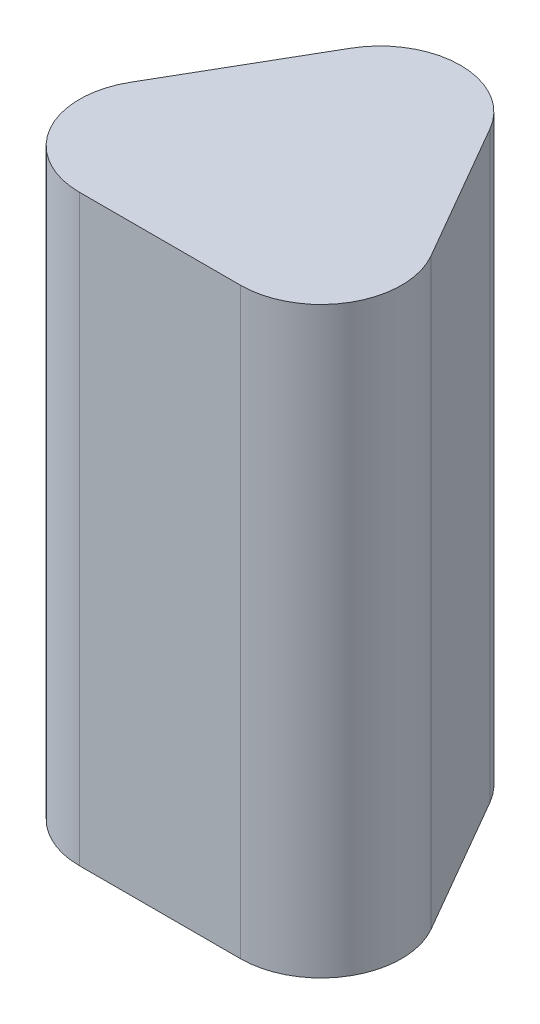
ISO-10303-21;
HEADER;
FILE_DESCRIPTION(('STEP AP214'),'2;1');
FILE_NAME('part.step','',(''),(''),'','','');
FILE_SCHEMA(('AUTOMOTIVE_DESIGN { 1 0 10303 214 1 1 1 1 }'));
ENDSEC;
DATA;
#1=APPLICATION_CONTEXT('core data for automotive mechanical design processes');
#2=APPLICATION_PROTOCOL_DEFINITION('international standard','automotive_design',2000,#1);
#3=PRODUCT_CONTEXT('',#1,'mechanical');
#4=PRODUCT('Part','Part','',(#3));
#5=PRODUCT_RELATED_PRODUCT_CATEGORY('part','',(#4));
#6=PRODUCT_DEFINITION_FORMATION('','',#4);
#7=PRODUCT_DEFINITION_CONTEXT('part definition',#1,'design');
#8=PRODUCT_DEFINITION('design','',#6,#7);
#9=PRODUCT_DEFINITION_SHAPE('','',#8);
#10=(LENGTH_UNIT() NAMED_UNIT(*) SI_UNIT(.MILLI.,.METRE.));
#11=(NAMED_UNIT(*) PLANE_ANGLE_UNIT() SI_UNIT($,.RADIAN.));
#12=(NAMED_UNIT(*) SI_UNIT($,.STERADIAN.) SOLID_ANGLE_UNIT());
#13=UNCERTAINTY_MEASURE_WITH_UNIT(LENGTH_MEASURE(1.E-05),#10,'distance_accuracy_value','');
#14=(GEOMETRIC_REPRESENTATION_CONTEXT(3) GLOBAL_UNCERTAINTY_ASSIGNED_CONTEXT((#13)) GLOBAL_UNIT_ASSIGNED_CONTEXT((#10,
#11,#12)) REPRESENTATION_CONTEXT('',''));
#15=CARTESIAN_POINT('',(0.,0.,0.));
#16=DIRECTION('',(0.,0.,1.));
#17=DIRECTION('',(1.,0.,0.));
#18=AXIS2_PLACEMENT_3D('',#15,#16,#17);
#19=CARTESIAN_POINT('',(-9.25,67.,25.2714699700121));
#20=DIRECTION('',(0.,-1.,0.));
#21=DIRECTION('',(0.,0.,-1.));
#22=AXIS2_PLACEMENT_3D('',#19,#20,#21);
#23=CYLINDRICAL_SURFACE('',#22,9.25);
#24=CARTESIAN_POINT('',(-9.25,0.,25.2714699700121));
#25=DIRECTION('',(0.,1.,0.));
#26=DIRECTION('',(0.,0.,1.));
#27=AXIS2_PLACEMENT_3D('',#24,#25,#26);
#28=CIRCLE('',#27,9.25);
#29=CARTESIAN_POINT('',(-17.2607349850061,0.,20.6464699700121));
#30=VERTEX_POINT('',#29);
#31=CARTESIAN_POINT('',(-9.25,0.,34.5214699700121));
#32=VERTEX_POINT('',#31);
#33=EDGE_CURVE('E123',#30,#32,#28,.T.);
#34=ORIENTED_EDGE('',*,*,#33,.T.);
#35=DIRECTION('',(0.,-1.,0.));
#36=VECTOR('',#35,1.);
#37=CARTESIAN_POINT('',(-9.25,67.,34.5214699700121));
#38=LINE('',#37,#36);
#39=CARTESIAN_POINT('',(-9.25,67.,34.5214699700121));
#40=VERTEX_POINT('',#39);
#41=EDGE_CURVE('E11',#40,#32,#38,.T.);
#42=ORIENTED_EDGE('',*,*,#41,.F.);
#43=CARTESIAN_POINT('',(-9.25,67.,25.2714699700121));
#44=DIRECTION('',(0.,1.,0.));
#45=DIRECTION('',(0.,0.,1.));
#46=AXIS2_PLACEMENT_3D('',#43,#44,#45);
#47=CIRCLE('',#46,9.25);
#48=CARTESIAN_POINT('',(-17.2607349850061,67.,20.6464699700121));
#49=VERTEX_POINT('',#48);
#50=EDGE_CURVE('E133',#49,#40,#47,.T.);
#51=ORIENTED_EDGE('',*,*,#50,.F.);
#52=DIRECTION('',(0.,-1.,0.));
#53=VECTOR('',#52,1.);
#54=CARTESIAN_POINT('',(-17.2607349850061,67.,20.6464699700121));
#55=LINE('',#54,#53);
#56=EDGE_CURVE('E119',#49,#30,#55,.T.);
#57=ORIENTED_EDGE('',*,*,#56,.T.);
#58=EDGE_LOOP('',(#34,#42,#51,#57));
#59=FACE_BOUND('',#58,.T.);
#60=ADVANCED_FACE('F39',(#59),#23,.T.);
#61=CARTESIAN_POINT('',(-9.25,67.,34.5214699700121));
#62=DIRECTION('',(0.,0.,-1.));
#63=DIRECTION('',(-1.,0.,0.));
#64=AXIS2_PLACEMENT_3D('',#61,#62,#63);
#65=PLANE('',#64);
#66=DIRECTION('',(1.,0.,0.));
#67=VECTOR('',#66,1.);
#68=CARTESIAN_POINT('',(-9.25,0.,34.5214699700121));
#69=LINE('',#68,#67);
#70=CARTESIAN_POINT('',(9.25,0.,34.5214699700121));
#71=VERTEX_POINT('',#70);
#72=EDGE_CURVE('E126',#32,#71,#69,.T.);
#73=ORIENTED_EDGE('',*,*,#72,.T.);
#74=DIRECTION('',(0.,-1.,0.));
#75=VECTOR('',#74,1.);
#76=CARTESIAN_POINT('',(9.25,67.,34.5214699700121));
#77=LINE('',#76,#75);
#78=CARTESIAN_POINT('',(9.25,67.,34.5214699700121));
#79=VERTEX_POINT('',#78);
#80=EDGE_CURVE('E47',#79,#71,#77,.T.);
#81=ORIENTED_EDGE('',*,*,#80,.F.);
#82=DIRECTION('',(1.,0.,0.));
#83=VECTOR('',#82,1.);
#84=CARTESIAN_POINT('',(-9.25,67.,34.5214699700121));
#85=LINE('',#84,#83);
#86=EDGE_CURVE('E92',#40,#79,#85,.T.);
#87=ORIENTED_EDGE('',*,*,#86,.F.);
#88=ORIENTED_EDGE('',*,*,#41,.T.);
#89=EDGE_LOOP('',(#73,#81,#87,#88));
#90=FACE_BOUND('',#89,.T.);
#91=ADVANCED_FACE('F157',(#90),#65,.F.);
#92=CARTESIAN_POINT('',(9.25,67.,25.2714699700121));
#93=DIRECTION('',(0.,-1.,0.));
#94=DIRECTION('',(0.,0.,-1.));
#95=AXIS2_PLACEMENT_3D('',#92,#93,#94);
#96=CYLINDRICAL_SURFACE('',#95,9.25);
#97=CARTESIAN_POINT('',(9.25,0.,25.2714699700121));
#98=DIRECTION('',(0.,1.,0.));
#99=DIRECTION('',(0.,0.,-1.));
#100=AXIS2_PLACEMENT_3D('',#97,#98,#99);
#101=CIRCLE('',#100,9.25);
#102=CARTESIAN_POINT('',(17.2607349850061,0.,20.6464699700121));
#103=VERTEX_POINT('',#102);
#104=EDGE_CURVE('E128',#71,#103,#101,.T.);
#105=ORIENTED_EDGE('',*,*,#104,.T.);
#106=DIRECTION('',(0.,-1.,0.));
#107=VECTOR('',#106,1.);
#108=CARTESIAN_POINT('',(17.2607349850061,67.,20.6464699700121));
#109=LINE('',#108,#107);
#110=CARTESIAN_POINT('',(17.2607349850061,67.,20.6464699700121));
#111=VERTEX_POINT('',#110);
#112=EDGE_CURVE('E114',#111,#103,#109,.T.);
#113=ORIENTED_EDGE('',*,*,#112,.F.);
#114=CARTESIAN_POINT('',(9.25,67.,25.2714699700121));
#115=DIRECTION('',(0.,1.,0.));
#116=DIRECTION('',(0.,0.,-1.));
#117=AXIS2_PLACEMENT_3D('',#114,#115,#116);
#118=CIRCLE('',#117,9.25);
#119=EDGE_CURVE('E105',#79,#111,#118,.T.);
#120=ORIENTED_EDGE('',*,*,#119,.F.);
#121=ORIENTED_EDGE('',*,*,#80,.T.);
#122=EDGE_LOOP('',(#105,#113,#120,#121));
#123=FACE_BOUND('',#122,.T.);
#124=ADVANCED_FACE('F139',(#123),#96,.T.);
#125=CARTESIAN_POINT('',(8.01073498500606,67.,4.625));
#126=DIRECTION('',(-0.866025403784439,0.,0.5));
#127=DIRECTION('',(0.5,0.,0.866025403784439));
#128=AXIS2_PLACEMENT_3D('',#125,#126,#127);
#129=PLANE('',#128);
#130=DIRECTION('',(-0.5,0.,-0.866025403784439));
#131=VECTOR('',#130,1.);
#132=CARTESIAN_POINT('',(8.01073498500606,0.,4.625));
#133=LINE('',#132,#131);
#134=CARTESIAN_POINT('',(8.01073498500606,0.,4.625));
#135=VERTEX_POINT('',#134);
#136=EDGE_CURVE('E113',#103,#135,#133,.T.);
#137=ORIENTED_EDGE('',*,*,#136,.T.);
#138=DIRECTION('',(0.,-1.,0.));
#139=VECTOR('',#138,1.);
#140=CARTESIAN_POINT('',(8.01073498500606,67.,4.625));
#141=LINE('',#140,#139);
#142=CARTESIAN_POINT('',(8.01073498500606,67.,4.625));
#143=VERTEX_POINT('',#142);
#144=EDGE_CURVE('E110',#143,#135,#141,.T.);
#145=ORIENTED_EDGE('',*,*,#144,.F.);
#146=DIRECTION('',(-0.5,0.,-0.866025403784439));
#147=VECTOR('',#146,1.);
#148=CARTESIAN_POINT('',(8.01073498500606,67.,4.625));
#149=LINE('',#148,#147);
#150=EDGE_CURVE('E99',#111,#143,#149,.T.);
#151=ORIENTED_EDGE('',*,*,#150,.F.);
#152=ORIENTED_EDGE('',*,*,#112,.T.);
#153=EDGE_LOOP('',(#137,#145,#151,#152));
#154=FACE_BOUND('',#153,.T.);
#155=ADVANCED_FACE('F111',(#154),#129,.F.);
#156=CARTESIAN_POINT('',(0.,67.,9.25));
#157=DIRECTION('',(0.,-1.,0.));
#158=DIRECTION('',(0.,0.,-1.));
#159=AXIS2_PLACEMENT_3D('',#156,#157,#158);
#160=CYLINDRICAL_SURFACE('',#159,9.25);
#161=CARTESIAN_POINT('',(0.,0.,9.25));
#162=DIRECTION('',(0.,1.,0.));
#163=DIRECTION('',(0.,0.,1.));
#164=AXIS2_PLACEMENT_3D('',#161,#162,#163);
#165=CIRCLE('',#164,9.25);
#166=CARTESIAN_POINT('',(-8.01073498500606,0.,4.625));
#167=VERTEX_POINT('',#166);
#168=EDGE_CURVE('E78',#135,#167,#165,.T.);
#169=ORIENTED_EDGE('',*,*,#168,.T.);
#170=DIRECTION('',(0.,-1.,0.));
#171=VECTOR('',#170,1.);
#172=CARTESIAN_POINT('',(-8.01073498500606,67.,4.625));
#173=LINE('',#172,#171);
#174=CARTESIAN_POINT('',(-8.01073498500606,67.,4.625));
#175=VERTEX_POINT('',#174);
#176=EDGE_CURVE('E115',#175,#167,#173,.T.);
#177=ORIENTED_EDGE('',*,*,#176,.F.);
#178=CARTESIAN_POINT('',(0.,67.,9.25));
#179=DIRECTION('',(0.,1.,0.));
#180=DIRECTION('',(0.,0.,1.));
#181=AXIS2_PLACEMENT_3D('',#178,#179,#180);
#182=CIRCLE('',#181,9.25);
#183=EDGE_CURVE('E103',#143,#175,#182,.T.);
#184=ORIENTED_EDGE('',*,*,#183,.F.);
#185=ORIENTED_EDGE('',*,*,#144,.T.);
#186=EDGE_LOOP('',(#169,#177,#184,#185));
#187=FACE_BOUND('',#186,.T.);
#188=ADVANCED_FACE('F117',(#187),#160,.T.);
#189=CARTESIAN_POINT('',(-17.2607349850061,67.,20.6464699700121));
#190=DIRECTION('',(0.866025403784439,0.,0.5));
#191=DIRECTION('',(0.5,0.,-0.866025403784439));
#192=AXIS2_PLACEMENT_3D('',#189,#190,#191);
#193=PLANE('',#192);
#194=DIRECTION('',(-0.5,0.,0.866025403784439));
#195=VECTOR('',#194,1.);
#196=CARTESIAN_POINT('',(-17.2607349850061,0.,20.6464699700121));
#197=LINE('',#196,#195);
#198=EDGE_CURVE('E84',#167,#30,#197,.T.);
#199=ORIENTED_EDGE('',*,*,#198,.T.);
#200=ORIENTED_EDGE('',*,*,#56,.F.);
#201=DIRECTION('',(-0.5,0.,0.866025403784439));
#202=VECTOR('',#201,1.);
#203=CARTESIAN_POINT('',(-17.2607349850061,67.,20.6464699700121));
#204=LINE('',#203,#202);
#205=EDGE_CURVE('E55',#175,#49,#204,.T.);
#206=ORIENTED_EDGE('',*,*,#205,.F.);
#207=ORIENTED_EDGE('',*,*,#176,.T.);
#208=EDGE_LOOP('',(#199,#200,#206,#207));
#209=FACE_BOUND('',#208,.T.);
#210=ADVANCED_FACE('F146',(#209),#193,.F.);
#211=CARTESIAN_POINT('',(-9.25,67.,25.2714699700121));
#212=DIRECTION('',(0.,1.,0.));
#213=DIRECTION('',(0.,0.,1.));
#214=AXIS2_PLACEMENT_3D('',#211,#212,#213);
#215=PLANE('',#214);
#216=ORIENTED_EDGE('',*,*,#50,.T.);
#217=ORIENTED_EDGE('',*,*,#86,.T.);
#218=ORIENTED_EDGE('',*,*,#119,.T.);
#219=ORIENTED_EDGE('',*,*,#150,.T.);
#220=ORIENTED_EDGE('',*,*,#183,.T.);
#221=ORIENTED_EDGE('',*,*,#205,.T.);
#222=EDGE_LOOP('',(#216,#217,#218,#219,#220,#221));
#223=FACE_BOUND('',#222,.T.);
#224=ADVANCED_FACE('F101',(#223),#215,.T.);
#225=CARTESIAN_POINT('',(-9.25,0.,25.2714699700121));
#226=DIRECTION('',(0.,1.,0.));
#227=DIRECTION('',(0.,0.,1.));
#228=AXIS2_PLACEMENT_3D('',#225,#226,#227);
#229=PLANE('',#228);
#230=ORIENTED_EDGE('',*,*,#33,.F.);
#231=ORIENTED_EDGE('',*,*,#198,.F.);
#232=ORIENTED_EDGE('',*,*,#168,.F.);
#233=ORIENTED_EDGE('',*,*,#136,.F.);
#234=ORIENTED_EDGE('',*,*,#104,.F.);
#235=ORIENTED_EDGE('',*,*,#72,.F.);
#236=EDGE_LOOP('',(#230,#231,#232,#233,#234,#235));
#237=FACE_BOUND('',#236,.T.);
#238=ADVANCED_FACE('F142',(#237),#229,.F.);
#239=CLOSED_SHELL('',(#60,#91,#124,#155,#188,#210,#224,#238));
#240=MANIFOLD_SOLID_BREP('B2',#239);
#241=ADVANCED_BREP_SHAPE_REPRESENTATION('',(#18,#240),#14);
#242=SHAPE_DEFINITION_REPRESENTATION(#9,#241);
ENDSEC;
END-ISO-10303-21;
